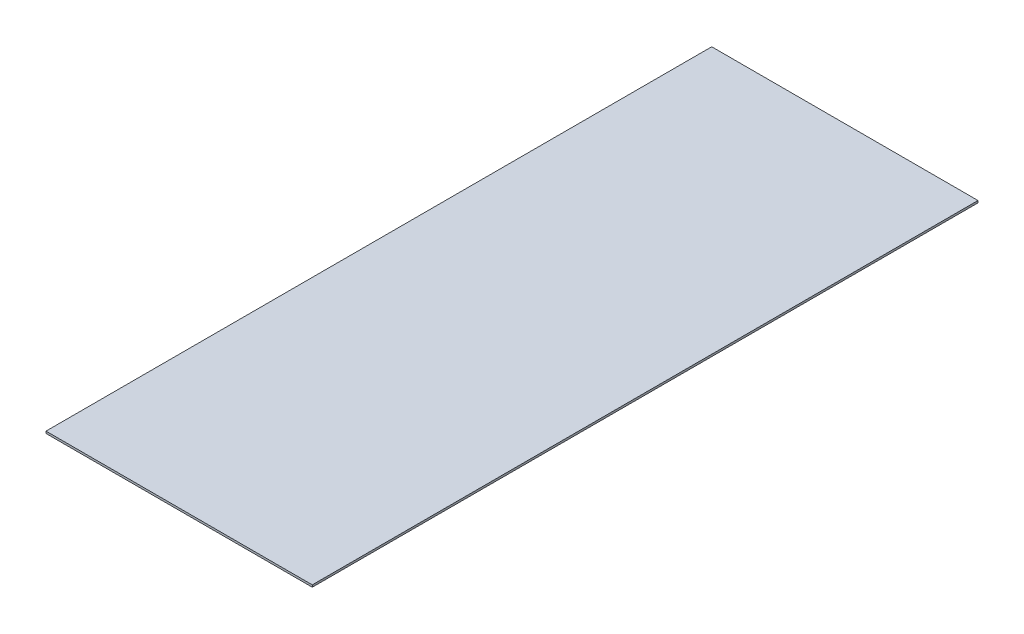
ISO-10303-21;
HEADER;
FILE_DESCRIPTION(('STEP AP214'),'2;1');
FILE_NAME('part.step','',(''),(''),'','','');
FILE_SCHEMA(('AUTOMOTIVE_DESIGN { 1 0 10303 214 1 1 1 1 }'));
ENDSEC;
DATA;
#1=APPLICATION_CONTEXT('core data for automotive mechanical design processes');
#2=APPLICATION_PROTOCOL_DEFINITION('international standard','automotive_design',2000,#1);
#3=PRODUCT_CONTEXT('',#1,'mechanical');
#4=PRODUCT('Part','Part','',(#3));
#5=PRODUCT_RELATED_PRODUCT_CATEGORY('part','',(#4));
#6=PRODUCT_DEFINITION_FORMATION('','',#4);
#7=PRODUCT_DEFINITION_CONTEXT('part definition',#1,'design');
#8=PRODUCT_DEFINITION('design','',#6,#7);
#9=PRODUCT_DEFINITION_SHAPE('','',#8);
#10=(LENGTH_UNIT() NAMED_UNIT(*) SI_UNIT(.MILLI.,.METRE.));
#11=(NAMED_UNIT(*) PLANE_ANGLE_UNIT() SI_UNIT($,.RADIAN.));
#12=(NAMED_UNIT(*) SI_UNIT($,.STERADIAN.) SOLID_ANGLE_UNIT());
#13=UNCERTAINTY_MEASURE_WITH_UNIT(LENGTH_MEASURE(1.E-05),#10,'distance_accuracy_value','');
#14=(GEOMETRIC_REPRESENTATION_CONTEXT(3) GLOBAL_UNCERTAINTY_ASSIGNED_CONTEXT((#13)) GLOBAL_UNIT_ASSIGNED_CONTEXT((#10,
#11,#12)) REPRESENTATION_CONTEXT('',''));
#15=CARTESIAN_POINT('',(0.,0.,0.));
#16=DIRECTION('',(0.,0.,1.));
#17=DIRECTION('',(1.,0.,0.));
#18=AXIS2_PLACEMENT_3D('',#15,#16,#17);
#19=CARTESIAN_POINT('',(609.6,9.5,1524.));
#20=DIRECTION('',(-1.,0.,0.));
#21=DIRECTION('',(0.,0.,1.));
#22=AXIS2_PLACEMENT_3D('',#19,#20,#21);
#23=PLANE('',#22);
#24=DIRECTION('',(0.,0.,-1.));
#25=VECTOR('',#24,1.);
#26=CARTESIAN_POINT('',(609.6,0.,1524.));
#27=LINE('',#26,#25);
#28=CARTESIAN_POINT('',(609.6,0.,1524.));
#29=VERTEX_POINT('',#28);
#30=CARTESIAN_POINT('',(609.6,0.,-1524.));
#31=VERTEX_POINT('',#30);
#32=EDGE_CURVE('E96',#29,#31,#27,.T.);
#33=ORIENTED_EDGE('',*,*,#32,.T.);
#34=DIRECTION('',(0.,-1.,0.));
#35=VECTOR('',#34,1.);
#36=CARTESIAN_POINT('',(609.6,9.5,-1524.));
#37=LINE('',#36,#35);
#38=CARTESIAN_POINT('',(609.6,9.5,-1524.));
#39=VERTEX_POINT('',#38);
#40=EDGE_CURVE('E11',#39,#31,#37,.T.);
#41=ORIENTED_EDGE('',*,*,#40,.F.);
#42=DIRECTION('',(0.,0.,-1.));
#43=VECTOR('',#42,1.);
#44=CARTESIAN_POINT('',(609.6,9.5,1524.));
#45=LINE('',#44,#43);
#46=CARTESIAN_POINT('',(609.6,9.5,1524.));
#47=VERTEX_POINT('',#46);
#48=EDGE_CURVE('E84',#47,#39,#45,.T.);
#49=ORIENTED_EDGE('',*,*,#48,.F.);
#50=DIRECTION('',(0.,-1.,0.));
#51=VECTOR('',#50,1.);
#52=CARTESIAN_POINT('',(609.6,9.5,1524.));
#53=LINE('',#52,#51);
#54=EDGE_CURVE('E92',#47,#29,#53,.T.);
#55=ORIENTED_EDGE('',*,*,#54,.T.);
#56=EDGE_LOOP('',(#33,#41,#49,#55));
#57=FACE_BOUND('',#56,.T.);
#58=ADVANCED_FACE('F33',(#57),#23,.F.);
#59=CARTESIAN_POINT('',(-609.6,9.5,-1524.));
#60=DIRECTION('',(0.,0.,1.));
#61=DIRECTION('',(1.,0.,0.));
#62=AXIS2_PLACEMENT_3D('',#59,#60,#61);
#63=PLANE('',#62);
#64=DIRECTION('',(-1.,0.,0.));
#65=VECTOR('',#64,1.);
#66=CARTESIAN_POINT('',(-609.6,0.,-1524.));
#67=LINE('',#66,#65);
#68=CARTESIAN_POINT('',(-609.6,0.,-1524.));
#69=VERTEX_POINT('',#68);
#70=EDGE_CURVE('E88',#31,#69,#67,.T.);
#71=ORIENTED_EDGE('',*,*,#70,.T.);
#72=DIRECTION('',(0.,-1.,0.));
#73=VECTOR('',#72,1.);
#74=CARTESIAN_POINT('',(-609.6,9.5,-1524.));
#75=LINE('',#74,#73);
#76=CARTESIAN_POINT('',(-609.6,9.5,-1524.));
#77=VERTEX_POINT('',#76);
#78=EDGE_CURVE('E41',#77,#69,#75,.T.);
#79=ORIENTED_EDGE('',*,*,#78,.F.);
#80=DIRECTION('',(-1.,0.,0.));
#81=VECTOR('',#80,1.);
#82=CARTESIAN_POINT('',(-609.6,9.5,-1524.));
#83=LINE('',#82,#81);
#84=EDGE_CURVE('E79',#39,#77,#83,.T.);
#85=ORIENTED_EDGE('',*,*,#84,.F.);
#86=ORIENTED_EDGE('',*,*,#40,.T.);
#87=EDGE_LOOP('',(#71,#79,#85,#86));
#88=FACE_BOUND('',#87,.T.);
#89=ADVANCED_FACE('F87',(#88),#63,.F.);
#90=CARTESIAN_POINT('',(-609.6,9.5,1524.));
#91=DIRECTION('',(1.,0.,0.));
#92=DIRECTION('',(0.,0.,-1.));
#93=AXIS2_PLACEMENT_3D('',#90,#91,#92);
#94=PLANE('',#93);
#95=DIRECTION('',(0.,0.,1.));
#96=VECTOR('',#95,1.);
#97=CARTESIAN_POINT('',(-609.6,0.,1524.));
#98=LINE('',#97,#96);
#99=CARTESIAN_POINT('',(-609.6,0.,1524.));
#100=VERTEX_POINT('',#99);
#101=EDGE_CURVE('E66',#69,#100,#98,.T.);
#102=ORIENTED_EDGE('',*,*,#101,.T.);
#103=DIRECTION('',(0.,-1.,0.));
#104=VECTOR('',#103,1.);
#105=CARTESIAN_POINT('',(-609.6,9.5,1524.));
#106=LINE('',#105,#104);
#107=CARTESIAN_POINT('',(-609.6,9.5,1524.));
#108=VERTEX_POINT('',#107);
#109=EDGE_CURVE('E89',#108,#100,#106,.T.);
#110=ORIENTED_EDGE('',*,*,#109,.F.);
#111=DIRECTION('',(0.,0.,1.));
#112=VECTOR('',#111,1.);
#113=CARTESIAN_POINT('',(-609.6,9.5,1524.));
#114=LINE('',#113,#112);
#115=EDGE_CURVE('E82',#77,#108,#114,.T.);
#116=ORIENTED_EDGE('',*,*,#115,.F.);
#117=ORIENTED_EDGE('',*,*,#78,.T.);
#118=EDGE_LOOP('',(#102,#110,#116,#117));
#119=FACE_BOUND('',#118,.T.);
#120=ADVANCED_FACE('F90',(#119),#94,.F.);
#121=CARTESIAN_POINT('',(-609.6,9.5,1524.));
#122=DIRECTION('',(0.,0.,-1.));
#123=DIRECTION('',(-1.,0.,0.));
#124=AXIS2_PLACEMENT_3D('',#121,#122,#123);
#125=PLANE('',#124);
#126=DIRECTION('',(1.,0.,0.));
#127=VECTOR('',#126,1.);
#128=CARTESIAN_POINT('',(-609.6,0.,1524.));
#129=LINE('',#128,#127);
#130=EDGE_CURVE('E72',#100,#29,#129,.T.);
#131=ORIENTED_EDGE('',*,*,#130,.T.);
#132=ORIENTED_EDGE('',*,*,#54,.F.);
#133=DIRECTION('',(1.,0.,0.));
#134=VECTOR('',#133,1.);
#135=CARTESIAN_POINT('',(-609.6,9.5,1524.));
#136=LINE('',#135,#134);
#137=EDGE_CURVE('E49',#108,#47,#136,.T.);
#138=ORIENTED_EDGE('',*,*,#137,.F.);
#139=ORIENTED_EDGE('',*,*,#109,.T.);
#140=EDGE_LOOP('',(#131,#132,#138,#139));
#141=FACE_BOUND('',#140,.T.);
#142=ADVANCED_FACE('F103',(#141),#125,.F.);
#143=CARTESIAN_POINT('',(0.,9.5,0.));
#144=DIRECTION('',(0.,-1.,0.));
#145=DIRECTION('',(0.,0.,-1.));
#146=AXIS2_PLACEMENT_3D('',#143,#144,#145);
#147=PLANE('',#146);
#148=ORIENTED_EDGE('',*,*,#48,.T.);
#149=ORIENTED_EDGE('',*,*,#84,.T.);
#150=ORIENTED_EDGE('',*,*,#115,.T.);
#151=ORIENTED_EDGE('',*,*,#137,.T.);
#152=EDGE_LOOP('',(#148,#149,#150,#151));
#153=FACE_BOUND('',#152,.T.);
#154=ADVANCED_FACE('F80',(#153),#147,.F.);
#155=CARTESIAN_POINT('',(0.,0.,0.));
#156=DIRECTION('',(0.,-1.,0.));
#157=DIRECTION('',(0.,0.,-1.));
#158=AXIS2_PLACEMENT_3D('',#155,#156,#157);
#159=PLANE('',#158);
#160=ORIENTED_EDGE('',*,*,#32,.F.);
#161=ORIENTED_EDGE('',*,*,#130,.F.);
#162=ORIENTED_EDGE('',*,*,#101,.F.);
#163=ORIENTED_EDGE('',*,*,#70,.F.);
#164=EDGE_LOOP('',(#160,#161,#162,#163));
#165=FACE_BOUND('',#164,.T.);
#166=ADVANCED_FACE('F106',(#165),#159,.T.);
#167=CLOSED_SHELL('',(#58,#89,#120,#142,#154,#166));
#168=MANIFOLD_SOLID_BREP('B2',#167);
#169=ADVANCED_BREP_SHAPE_REPRESENTATION('',(#18,#168),#14);
#170=SHAPE_DEFINITION_REPRESENTATION(#9,#169);
ENDSEC;
END-ISO-10303-21;
